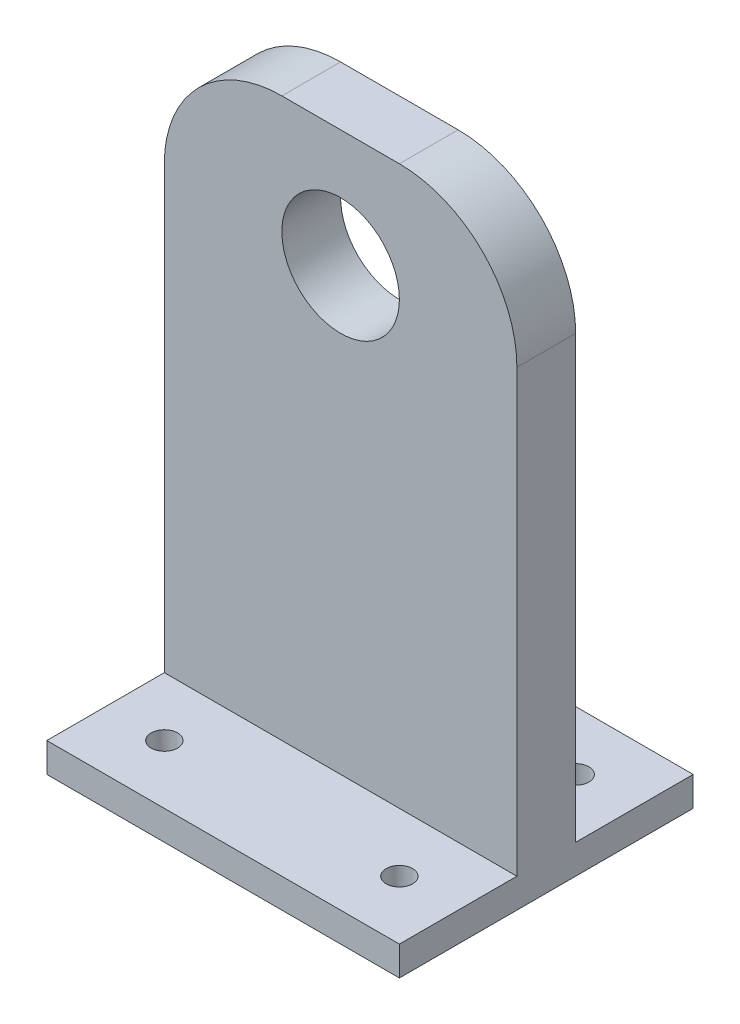
ISO-10303-21;
HEADER;
FILE_DESCRIPTION(('STEP AP214'),'2;1');
FILE_NAME('part.step','',(''),(''),'','','');
FILE_SCHEMA(('AUTOMOTIVE_DESIGN { 1 0 10303 214 1 1 1 1 }'));
ENDSEC;
DATA;
#1=APPLICATION_CONTEXT('core data for automotive mechanical design processes');
#2=APPLICATION_PROTOCOL_DEFINITION('international standard','automotive_design',2000,#1);
#3=PRODUCT_CONTEXT('',#1,'mechanical');
#4=PRODUCT('Part','Part','',(#3));
#5=PRODUCT_RELATED_PRODUCT_CATEGORY('part','',(#4));
#6=PRODUCT_DEFINITION_FORMATION('','',#4);
#7=PRODUCT_DEFINITION_CONTEXT('part definition',#1,'design');
#8=PRODUCT_DEFINITION('design','',#6,#7);
#9=PRODUCT_DEFINITION_SHAPE('','',#8);
#10=(LENGTH_UNIT() NAMED_UNIT(*) SI_UNIT(.MILLI.,.METRE.));
#11=(NAMED_UNIT(*) PLANE_ANGLE_UNIT() SI_UNIT($,.RADIAN.));
#12=(NAMED_UNIT(*) SI_UNIT($,.STERADIAN.) SOLID_ANGLE_UNIT());
#13=UNCERTAINTY_MEASURE_WITH_UNIT(LENGTH_MEASURE(1.E-05),#10,'distance_accuracy_value','');
#14=(GEOMETRIC_REPRESENTATION_CONTEXT(3) GLOBAL_UNCERTAINTY_ASSIGNED_CONTEXT((#13)) GLOBAL_UNIT_ASSIGNED_CONTEXT((#10,
#11,#12)) REPRESENTATION_CONTEXT('',''));
#15=CARTESIAN_POINT('',(0.,0.,0.));
#16=DIRECTION('',(0.,0.,1.));
#17=DIRECTION('',(1.,0.,0.));
#18=AXIS2_PLACEMENT_3D('',#15,#16,#17);
#19=CARTESIAN_POINT('',(0.,0.,10.));
#20=DIRECTION('',(0.,0.,1.));
#21=DIRECTION('',(1.,0.,0.));
#22=AXIS2_PLACEMENT_3D('',#19,#20,#21);
#23=PLANE('',#22);
#24=CARTESIAN_POINT('',(0.,80.,10.));
#25=DIRECTION('',(0.,0.,1.));
#26=DIRECTION('',(1.,0.,0.));
#27=AXIS2_PLACEMENT_3D('',#24,#25,#26);
#28=CIRCLE('',#27,10.);
#29=CARTESIAN_POINT('',(10.,80.,10.));
#30=VERTEX_POINT('',#29);
#31=EDGE_CURVE('E161',#30,#30,#28,.T.);
#32=ORIENTED_EDGE('',*,*,#31,.F.);
#33=EDGE_LOOP('',(#32));
#34=FACE_BOUND('',#33,.T.);
#35=DIRECTION('',(0.,-1.,0.));
#36=VECTOR('',#35,1.);
#37=CARTESIAN_POINT('',(-30.,100.,10.));
#38=LINE('',#37,#36);
#39=CARTESIAN_POINT('',(-30.,80.,10.));
#40=VERTEX_POINT('',#39);
#41=CARTESIAN_POINT('',(-30.,5.,10.));
#42=VERTEX_POINT('',#41);
#43=EDGE_CURVE('E52',#40,#42,#38,.T.);
#44=ORIENTED_EDGE('',*,*,#43,.T.);
#45=DIRECTION('',(1.,0.,0.));
#46=VECTOR('',#45,1.);
#47=CARTESIAN_POINT('',(0.,5.,10.));
#48=LINE('',#47,#46);
#49=CARTESIAN_POINT('',(30.,5.,10.));
#50=VERTEX_POINT('',#49);
#51=EDGE_CURVE('E56',#42,#50,#48,.T.);
#52=ORIENTED_EDGE('',*,*,#51,.T.);
#53=DIRECTION('',(0.,1.,0.));
#54=VECTOR('',#53,1.);
#55=CARTESIAN_POINT('',(30.,100.,10.));
#56=LINE('',#55,#54);
#57=CARTESIAN_POINT('',(30.,80.,10.));
#58=VERTEX_POINT('',#57);
#59=EDGE_CURVE('E165',#50,#58,#56,.T.);
#60=ORIENTED_EDGE('',*,*,#59,.T.);
#61=CARTESIAN_POINT('',(10.,80.,10.));
#62=DIRECTION('',(0.,0.,1.));
#63=DIRECTION('',(1.,0.,0.));
#64=AXIS2_PLACEMENT_3D('',#61,#62,#63);
#65=CIRCLE('',#64,20.);
#66=CARTESIAN_POINT('',(10.,100.,10.));
#67=VERTEX_POINT('',#66);
#68=EDGE_CURVE('E45',#58,#67,#65,.T.);
#69=ORIENTED_EDGE('',*,*,#68,.T.);
#70=DIRECTION('',(-1.,0.,0.));
#71=VECTOR('',#70,1.);
#72=CARTESIAN_POINT('',(-30.,100.,10.));
#73=LINE('',#72,#71);
#74=CARTESIAN_POINT('',(-9.99999999999999,100.,10.));
#75=VERTEX_POINT('',#74);
#76=EDGE_CURVE('E168',#67,#75,#73,.T.);
#77=ORIENTED_EDGE('',*,*,#76,.T.);
#78=CARTESIAN_POINT('',(-9.99999999999999,80.,10.));
#79=DIRECTION('',(0.,0.,1.));
#80=DIRECTION('',(1.,0.,0.));
#81=AXIS2_PLACEMENT_3D('',#78,#79,#80);
#82=CIRCLE('',#81,20.);
#83=EDGE_CURVE('E193',#75,#40,#82,.T.);
#84=ORIENTED_EDGE('',*,*,#83,.T.);
#85=EDGE_LOOP('',(#44,#52,#60,#69,#77,#84));
#86=FACE_BOUND('',#85,.T.);
#87=ADVANCED_FACE('F36',(#34,#86),#23,.T.);
#88=CARTESIAN_POINT('',(0.,0.,0.));
#89=DIRECTION('',(0.,0.,1.));
#90=DIRECTION('',(1.,0.,0.));
#91=AXIS2_PLACEMENT_3D('',#88,#89,#90);
#92=PLANE('',#91);
#93=CARTESIAN_POINT('',(0.,80.,0.));
#94=DIRECTION('',(0.,0.,1.));
#95=DIRECTION('',(1.,0.,0.));
#96=AXIS2_PLACEMENT_3D('',#93,#94,#95);
#97=CIRCLE('',#96,10.);
#98=CARTESIAN_POINT('',(10.,80.,0.));
#99=VERTEX_POINT('',#98);
#100=EDGE_CURVE('E40',#99,#99,#97,.T.);
#101=ORIENTED_EDGE('',*,*,#100,.T.);
#102=EDGE_LOOP('',(#101));
#103=FACE_BOUND('',#102,.T.);
#104=DIRECTION('',(1.,0.,0.));
#105=VECTOR('',#104,1.);
#106=CARTESIAN_POINT('',(0.,5.,0.));
#107=LINE('',#106,#105);
#108=CARTESIAN_POINT('',(-30.,5.,0.));
#109=VERTEX_POINT('',#108);
#110=CARTESIAN_POINT('',(30.,5.,0.));
#111=VERTEX_POINT('',#110);
#112=EDGE_CURVE('E154',#109,#111,#107,.T.);
#113=ORIENTED_EDGE('',*,*,#112,.F.);
#114=DIRECTION('',(0.,-1.,0.));
#115=VECTOR('',#114,1.);
#116=CARTESIAN_POINT('',(-30.,100.,0.));
#117=LINE('',#116,#115);
#118=CARTESIAN_POINT('',(-30.,80.,0.));
#119=VERTEX_POINT('',#118);
#120=EDGE_CURVE('E118',#119,#109,#117,.T.);
#121=ORIENTED_EDGE('',*,*,#120,.F.);
#122=CARTESIAN_POINT('',(-9.99999999999999,80.,0.));
#123=DIRECTION('',(0.,0.,1.));
#124=DIRECTION('',(1.,0.,0.));
#125=AXIS2_PLACEMENT_3D('',#122,#123,#124);
#126=CIRCLE('',#125,20.);
#127=CARTESIAN_POINT('',(-9.99999999999999,100.,0.));
#128=VERTEX_POINT('',#127);
#129=EDGE_CURVE('E185',#119,#128,#126,.F.);
#130=ORIENTED_EDGE('',*,*,#129,.T.);
#131=DIRECTION('',(-1.,0.,0.));
#132=VECTOR('',#131,1.);
#133=CARTESIAN_POINT('',(-30.,100.,0.));
#134=LINE('',#133,#132);
#135=CARTESIAN_POINT('',(10.,100.,0.));
#136=VERTEX_POINT('',#135);
#137=EDGE_CURVE('E166',#136,#128,#134,.T.);
#138=ORIENTED_EDGE('',*,*,#137,.F.);
#139=CARTESIAN_POINT('',(10.,80.,0.));
#140=DIRECTION('',(0.,0.,1.));
#141=DIRECTION('',(1.,0.,0.));
#142=AXIS2_PLACEMENT_3D('',#139,#140,#141);
#143=CIRCLE('',#142,20.);
#144=CARTESIAN_POINT('',(30.,80.,0.));
#145=VERTEX_POINT('',#144);
#146=EDGE_CURVE('E187',#136,#145,#143,.F.);
#147=ORIENTED_EDGE('',*,*,#146,.T.);
#148=DIRECTION('',(0.,1.,0.));
#149=VECTOR('',#148,1.);
#150=CARTESIAN_POINT('',(30.,100.,0.));
#151=LINE('',#150,#149);
#152=EDGE_CURVE('E173',#111,#145,#151,.T.);
#153=ORIENTED_EDGE('',*,*,#152,.F.);
#154=EDGE_LOOP('',(#113,#121,#130,#138,#147,#153));
#155=FACE_BOUND('',#154,.T.);
#156=ADVANCED_FACE('F208',(#103,#155),#92,.F.);
#157=CARTESIAN_POINT('',(0.,80.,10.));
#158=DIRECTION('',(0.,0.,-1.));
#159=DIRECTION('',(-1.,0.,0.));
#160=AXIS2_PLACEMENT_3D('',#157,#158,#159);
#161=CYLINDRICAL_SURFACE('',#160,10.);
#162=ORIENTED_EDGE('',*,*,#31,.T.);
#163=EDGE_LOOP('',(#162));
#164=FACE_BOUND('',#163,.T.);
#165=ORIENTED_EDGE('',*,*,#100,.F.);
#166=EDGE_LOOP('',(#165));
#167=FACE_BOUND('',#166,.T.);
#168=ADVANCED_FACE('F232',(#164,#167),#161,.F.);
#169=CARTESIAN_POINT('',(-30.,100.,10.));
#170=DIRECTION('',(1.,0.,0.));
#171=DIRECTION('',(0.,1.,0.));
#172=AXIS2_PLACEMENT_3D('',#169,#170,#171);
#173=PLANE('',#172);
#174=DIRECTION('',(0.,0.,-1.));
#175=VECTOR('',#174,1.);
#176=CARTESIAN_POINT('',(-30.,0.,10.));
#177=LINE('',#176,#175);
#178=CARTESIAN_POINT('',(-30.,0.,30.));
#179=VERTEX_POINT('',#178);
#180=CARTESIAN_POINT('',(-30.,0.,-20.));
#181=VERTEX_POINT('',#180);
#182=EDGE_CURVE('E178',#179,#181,#177,.T.);
#183=ORIENTED_EDGE('',*,*,#182,.F.);
#184=DIRECTION('',(0.,-1.,0.));
#185=VECTOR('',#184,1.);
#186=CARTESIAN_POINT('',(-30.,5.,30.));
#187=LINE('',#186,#185);
#188=CARTESIAN_POINT('',(-30.,5.,30.));
#189=VERTEX_POINT('',#188);
#190=EDGE_CURVE('E151',#189,#179,#187,.T.);
#191=ORIENTED_EDGE('',*,*,#190,.F.);
#192=DIRECTION('',(0.,0.,-1.));
#193=VECTOR('',#192,1.);
#194=CARTESIAN_POINT('',(-30.,5.,30.));
#195=LINE('',#194,#193);
#196=EDGE_CURVE('E122',#189,#42,#195,.T.);
#197=ORIENTED_EDGE('',*,*,#196,.T.);
#198=ORIENTED_EDGE('',*,*,#43,.F.);
#199=DIRECTION('',(0.,0.,-1.));
#200=VECTOR('',#199,1.);
#201=CARTESIAN_POINT('',(-30.,80.,10.));
#202=LINE('',#201,#200);
#203=EDGE_CURVE('E11',#40,#119,#202,.T.);
#204=ORIENTED_EDGE('',*,*,#203,.T.);
#205=ORIENTED_EDGE('',*,*,#120,.T.);
#206=CARTESIAN_POINT('',(-30.,5.,-20.));
#207=VERTEX_POINT('',#206);
#208=EDGE_CURVE('E112',#109,#207,#195,.T.);
#209=ORIENTED_EDGE('',*,*,#208,.T.);
#210=DIRECTION('',(0.,-1.,0.));
#211=VECTOR('',#210,1.);
#212=CARTESIAN_POINT('',(-30.,5.,-20.));
#213=LINE('',#212,#211);
#214=EDGE_CURVE('E115',#207,#181,#213,.T.);
#215=ORIENTED_EDGE('',*,*,#214,.T.);
#216=EDGE_LOOP('',(#183,#191,#197,#198,#204,#205,#209,#215));
#217=FACE_BOUND('',#216,.T.);
#218=ADVANCED_FACE('F114',(#217),#173,.F.);
#219=CARTESIAN_POINT('',(-30.,0.,10.));
#220=DIRECTION('',(0.,1.,0.));
#221=DIRECTION('',(0.,0.,1.));
#222=AXIS2_PLACEMENT_3D('',#219,#220,#221);
#223=PLANE('',#222);
#224=CARTESIAN_POINT('',(20.,0.,-10.));
#225=DIRECTION('',(0.,1.,0.));
#226=DIRECTION('',(0.,0.,1.));
#227=AXIS2_PLACEMENT_3D('',#224,#225,#226);
#228=CIRCLE('',#227,2.25);
#229=CARTESIAN_POINT('',(20.,0.,-7.75));
#230=VERTEX_POINT('',#229);
#231=EDGE_CURVE('E298',#230,#230,#228,.T.);
#232=ORIENTED_EDGE('',*,*,#231,.T.);
#233=EDGE_LOOP('',(#232));
#234=FACE_BOUND('',#233,.T.);
#235=CARTESIAN_POINT('',(-20.,0.,20.));
#236=DIRECTION('',(0.,1.,0.));
#237=DIRECTION('',(0.,0.,1.));
#238=AXIS2_PLACEMENT_3D('',#235,#236,#237);
#239=CIRCLE('',#238,2.25);
#240=CARTESIAN_POINT('',(-20.,0.,22.25));
#241=VERTEX_POINT('',#240);
#242=EDGE_CURVE('E304',#241,#241,#239,.T.);
#243=ORIENTED_EDGE('',*,*,#242,.T.);
#244=EDGE_LOOP('',(#243));
#245=FACE_BOUND('',#244,.T.);
#246=CARTESIAN_POINT('',(20.,0.,20.));
#247=DIRECTION('',(0.,1.,0.));
#248=DIRECTION('',(0.,0.,1.));
#249=AXIS2_PLACEMENT_3D('',#246,#247,#248);
#250=CIRCLE('',#249,2.25);
#251=CARTESIAN_POINT('',(20.,0.,22.25));
#252=VERTEX_POINT('',#251);
#253=EDGE_CURVE('E288',#252,#252,#250,.T.);
#254=ORIENTED_EDGE('',*,*,#253,.T.);
#255=EDGE_LOOP('',(#254));
#256=FACE_BOUND('',#255,.T.);
#257=CARTESIAN_POINT('',(-20.,0.,-10.));
#258=DIRECTION('',(0.,1.,0.));
#259=DIRECTION('',(0.,0.,1.));
#260=AXIS2_PLACEMENT_3D('',#257,#258,#259);
#261=CIRCLE('',#260,2.25);
#262=CARTESIAN_POINT('',(-20.,0.,-7.75));
#263=VERTEX_POINT('',#262);
#264=EDGE_CURVE('E148',#263,#263,#261,.T.);
#265=ORIENTED_EDGE('',*,*,#264,.T.);
#266=EDGE_LOOP('',(#265));
#267=FACE_BOUND('',#266,.T.);
#268=ORIENTED_EDGE('',*,*,#182,.T.);
#269=DIRECTION('',(1.,0.,0.));
#270=VECTOR('',#269,1.);
#271=CARTESIAN_POINT('',(-30.,0.,-20.));
#272=LINE('',#271,#270);
#273=CARTESIAN_POINT('',(30.,0.,-20.));
#274=VERTEX_POINT('',#273);
#275=EDGE_CURVE('E131',#181,#274,#272,.T.);
#276=ORIENTED_EDGE('',*,*,#275,.T.);
#277=DIRECTION('',(0.,0.,-1.));
#278=VECTOR('',#277,1.);
#279=CARTESIAN_POINT('',(30.,0.,10.));
#280=LINE('',#279,#278);
#281=CARTESIAN_POINT('',(30.,0.,30.));
#282=VERTEX_POINT('',#281);
#283=EDGE_CURVE('E171',#282,#274,#280,.T.);
#284=ORIENTED_EDGE('',*,*,#283,.F.);
#285=DIRECTION('',(-1.,0.,0.));
#286=VECTOR('',#285,1.);
#287=CARTESIAN_POINT('',(-30.,0.,30.));
#288=LINE('',#287,#286);
#289=EDGE_CURVE('E123',#282,#179,#288,.T.);
#290=ORIENTED_EDGE('',*,*,#289,.T.);
#291=EDGE_LOOP('',(#268,#276,#284,#290));
#292=FACE_BOUND('',#291,.T.);
#293=ADVANCED_FACE('F223',(#234,#245,#256,#267,#292),#223,.F.);
#294=CARTESIAN_POINT('',(30.,100.,10.));
#295=DIRECTION('',(-1.,0.,0.));
#296=DIRECTION('',(0.,-1.,0.));
#297=AXIS2_PLACEMENT_3D('',#294,#295,#296);
#298=PLANE('',#297);
#299=ORIENTED_EDGE('',*,*,#283,.T.);
#300=DIRECTION('',(0.,-1.,0.));
#301=VECTOR('',#300,1.);
#302=CARTESIAN_POINT('',(30.,5.,-20.));
#303=LINE('',#302,#301);
#304=CARTESIAN_POINT('',(30.,5.,-20.));
#305=VERTEX_POINT('',#304);
#306=EDGE_CURVE('E132',#305,#274,#303,.T.);
#307=ORIENTED_EDGE('',*,*,#306,.F.);
#308=DIRECTION('',(0.,0.,1.));
#309=VECTOR('',#308,1.);
#310=CARTESIAN_POINT('',(30.,5.,30.));
#311=LINE('',#310,#309);
#312=EDGE_CURVE('E138',#305,#111,#311,.T.);
#313=ORIENTED_EDGE('',*,*,#312,.T.);
#314=ORIENTED_EDGE('',*,*,#152,.T.);
#315=DIRECTION('',(0.,0.,-1.));
#316=VECTOR('',#315,1.);
#317=CARTESIAN_POINT('',(30.,80.,10.));
#318=LINE('',#317,#316);
#319=EDGE_CURVE('E190',#145,#58,#318,.F.);
#320=ORIENTED_EDGE('',*,*,#319,.T.);
#321=ORIENTED_EDGE('',*,*,#59,.F.);
#322=CARTESIAN_POINT('',(30.,5.,30.));
#323=VERTEX_POINT('',#322);
#324=EDGE_CURVE('E139',#50,#323,#311,.T.);
#325=ORIENTED_EDGE('',*,*,#324,.T.);
#326=DIRECTION('',(0.,-1.,0.));
#327=VECTOR('',#326,1.);
#328=CARTESIAN_POINT('',(30.,5.,30.));
#329=LINE('',#328,#327);
#330=EDGE_CURVE('E155',#323,#282,#329,.T.);
#331=ORIENTED_EDGE('',*,*,#330,.T.);
#332=EDGE_LOOP('',(#299,#307,#313,#314,#320,#321,#325,#331));
#333=FACE_BOUND('',#332,.T.);
#334=ADVANCED_FACE('F221',(#333),#298,.F.);
#335=CARTESIAN_POINT('',(-30.,100.,10.));
#336=DIRECTION('',(0.,-1.,0.));
#337=DIRECTION('',(0.,0.,-1.));
#338=AXIS2_PLACEMENT_3D('',#335,#336,#337);
#339=PLANE('',#338);
#340=ORIENTED_EDGE('',*,*,#76,.F.);
#341=DIRECTION('',(0.,0.,-1.));
#342=VECTOR('',#341,1.);
#343=CARTESIAN_POINT('',(10.,100.,10.));
#344=LINE('',#343,#342);
#345=EDGE_CURVE('E182',#67,#136,#344,.T.);
#346=ORIENTED_EDGE('',*,*,#345,.T.);
#347=ORIENTED_EDGE('',*,*,#137,.T.);
#348=DIRECTION('',(0.,0.,-1.));
#349=VECTOR('',#348,1.);
#350=CARTESIAN_POINT('',(-9.99999999999999,100.,10.));
#351=LINE('',#350,#349);
#352=EDGE_CURVE('E180',#128,#75,#351,.F.);
#353=ORIENTED_EDGE('',*,*,#352,.T.);
#354=EDGE_LOOP('',(#340,#346,#347,#353));
#355=FACE_BOUND('',#354,.T.);
#356=ADVANCED_FACE('F202',(#355),#339,.F.);
#357=CARTESIAN_POINT('',(10.,80.,10.));
#358=DIRECTION('',(0.,0.,-1.));
#359=DIRECTION('',(-1.,0.,0.));
#360=AXIS2_PLACEMENT_3D('',#357,#358,#359);
#361=CYLINDRICAL_SURFACE('',#360,20.);
#362=ORIENTED_EDGE('',*,*,#68,.F.);
#363=ORIENTED_EDGE('',*,*,#319,.F.);
#364=ORIENTED_EDGE('',*,*,#146,.F.);
#365=ORIENTED_EDGE('',*,*,#345,.F.);
#366=EDGE_LOOP('',(#362,#363,#364,#365));
#367=FACE_BOUND('',#366,.T.);
#368=ADVANCED_FACE('F205',(#367),#361,.T.);
#369=CARTESIAN_POINT('',(-9.99999999999999,80.,10.));
#370=DIRECTION('',(0.,0.,-1.));
#371=DIRECTION('',(-1.,0.,0.));
#372=AXIS2_PLACEMENT_3D('',#369,#370,#371);
#373=CYLINDRICAL_SURFACE('',#372,20.);
#374=ORIENTED_EDGE('',*,*,#83,.F.);
#375=ORIENTED_EDGE('',*,*,#352,.F.);
#376=ORIENTED_EDGE('',*,*,#129,.F.);
#377=ORIENTED_EDGE('',*,*,#203,.F.);
#378=EDGE_LOOP('',(#374,#375,#376,#377));
#379=FACE_BOUND('',#378,.T.);
#380=ADVANCED_FACE('F38',(#379),#373,.T.);
#381=CARTESIAN_POINT('',(-30.,5.,-20.));
#382=DIRECTION('',(0.,0.,-1.));
#383=DIRECTION('',(-1.,0.,0.));
#384=AXIS2_PLACEMENT_3D('',#381,#382,#383);
#385=PLANE('',#384);
#386=ORIENTED_EDGE('',*,*,#275,.F.);
#387=ORIENTED_EDGE('',*,*,#214,.F.);
#388=DIRECTION('',(1.,0.,0.));
#389=VECTOR('',#388,1.);
#390=CARTESIAN_POINT('',(-30.,5.,-20.));
#391=LINE('',#390,#389);
#392=EDGE_CURVE('E129',#207,#305,#391,.T.);
#393=ORIENTED_EDGE('',*,*,#392,.T.);
#394=ORIENTED_EDGE('',*,*,#306,.T.);
#395=EDGE_LOOP('',(#386,#387,#393,#394));
#396=FACE_BOUND('',#395,.T.);
#397=ADVANCED_FACE('F127',(#396),#385,.T.);
#398=CARTESIAN_POINT('',(0.,5.,0.));
#399=DIRECTION('',(0.,-1.,0.));
#400=DIRECTION('',(0.,0.,-1.));
#401=AXIS2_PLACEMENT_3D('',#398,#399,#400);
#402=PLANE('',#401);
#403=CARTESIAN_POINT('',(20.,5.,-10.));
#404=DIRECTION('',(0.,1.,0.));
#405=DIRECTION('',(0.,0.,1.));
#406=AXIS2_PLACEMENT_3D('',#403,#404,#405);
#407=CIRCLE('',#406,2.25);
#408=CARTESIAN_POINT('',(20.,5.,-7.75));
#409=VERTEX_POINT('',#408);
#410=EDGE_CURVE('E301',#409,#409,#407,.T.);
#411=ORIENTED_EDGE('',*,*,#410,.F.);
#412=EDGE_LOOP('',(#411));
#413=FACE_BOUND('',#412,.T.);
#414=CARTESIAN_POINT('',(-20.,5.,-10.));
#415=DIRECTION('',(0.,1.,0.));
#416=DIRECTION('',(0.,0.,1.));
#417=AXIS2_PLACEMENT_3D('',#414,#415,#416);
#418=CIRCLE('',#417,2.25);
#419=CARTESIAN_POINT('',(-20.,5.,-7.75));
#420=VERTEX_POINT('',#419);
#421=EDGE_CURVE('E300',#420,#420,#418,.T.);
#422=ORIENTED_EDGE('',*,*,#421,.F.);
#423=EDGE_LOOP('',(#422));
#424=FACE_BOUND('',#423,.T.);
#425=ORIENTED_EDGE('',*,*,#208,.F.);
#426=ORIENTED_EDGE('',*,*,#112,.T.);
#427=ORIENTED_EDGE('',*,*,#312,.F.);
#428=ORIENTED_EDGE('',*,*,#392,.F.);
#429=EDGE_LOOP('',(#425,#426,#427,#428));
#430=FACE_BOUND('',#429,.T.);
#431=ADVANCED_FACE('F136',(#413,#424,#430),#402,.F.);
#432=CARTESIAN_POINT('',(-30.,5.,30.));
#433=DIRECTION('',(0.,0.,1.));
#434=DIRECTION('',(1.,0.,0.));
#435=AXIS2_PLACEMENT_3D('',#432,#433,#434);
#436=PLANE('',#435);
#437=ORIENTED_EDGE('',*,*,#289,.F.);
#438=ORIENTED_EDGE('',*,*,#330,.F.);
#439=DIRECTION('',(-1.,0.,0.));
#440=VECTOR('',#439,1.);
#441=CARTESIAN_POINT('',(-30.,5.,30.));
#442=LINE('',#441,#440);
#443=EDGE_CURVE('E133',#323,#189,#442,.T.);
#444=ORIENTED_EDGE('',*,*,#443,.T.);
#445=ORIENTED_EDGE('',*,*,#190,.T.);
#446=EDGE_LOOP('',(#437,#438,#444,#445));
#447=FACE_BOUND('',#446,.T.);
#448=ADVANCED_FACE('F219',(#447),#436,.T.);
#449=CARTESIAN_POINT('',(-20.,5.,20.));
#450=DIRECTION('',(0.,1.,0.));
#451=DIRECTION('',(0.,0.,1.));
#452=AXIS2_PLACEMENT_3D('',#449,#450,#451);
#453=CIRCLE('',#452,2.25);
#454=CARTESIAN_POINT('',(-20.,5.,22.25));
#455=VERTEX_POINT('',#454);
#456=EDGE_CURVE('E294',#455,#455,#453,.T.);
#457=ORIENTED_EDGE('',*,*,#456,.F.);
#458=EDGE_LOOP('',(#457));
#459=FACE_BOUND('',#458,.T.);
#460=CARTESIAN_POINT('',(20.,5.,20.));
#461=DIRECTION('',(0.,1.,0.));
#462=DIRECTION('',(0.,0.,1.));
#463=AXIS2_PLACEMENT_3D('',#460,#461,#462);
#464=CIRCLE('',#463,2.25);
#465=CARTESIAN_POINT('',(20.,5.,22.25));
#466=VERTEX_POINT('',#465);
#467=EDGE_CURVE('E291',#466,#466,#464,.T.);
#468=ORIENTED_EDGE('',*,*,#467,.F.);
#469=EDGE_LOOP('',(#468));
#470=FACE_BOUND('',#469,.T.);
#471=ORIENTED_EDGE('',*,*,#51,.F.);
#472=ORIENTED_EDGE('',*,*,#196,.F.);
#473=ORIENTED_EDGE('',*,*,#443,.F.);
#474=ORIENTED_EDGE('',*,*,#324,.F.);
#475=EDGE_LOOP('',(#471,#472,#473,#474));
#476=FACE_BOUND('',#475,.T.);
#477=ADVANCED_FACE('F214',(#459,#470,#476),#402,.F.);
#478=CARTESIAN_POINT('',(20.,0.,20.));
#479=DIRECTION('',(0.,1.,0.));
#480=DIRECTION('',(0.,0.,1.));
#481=AXIS2_PLACEMENT_3D('',#478,#479,#480);
#482=CYLINDRICAL_SURFACE('',#481,2.25);
#483=ORIENTED_EDGE('',*,*,#253,.F.);
#484=EDGE_LOOP('',(#483));
#485=FACE_BOUND('',#484,.T.);
#486=ORIENTED_EDGE('',*,*,#467,.T.);
#487=EDGE_LOOP('',(#486));
#488=FACE_BOUND('',#487,.T.);
#489=ADVANCED_FACE('F267',(#485,#488),#482,.F.);
#490=CARTESIAN_POINT('',(-20.,0.,20.));
#491=DIRECTION('',(0.,1.,0.));
#492=DIRECTION('',(0.,0.,1.));
#493=AXIS2_PLACEMENT_3D('',#490,#491,#492);
#494=CYLINDRICAL_SURFACE('',#493,2.25);
#495=ORIENTED_EDGE('',*,*,#242,.F.);
#496=EDGE_LOOP('',(#495));
#497=FACE_BOUND('',#496,.T.);
#498=ORIENTED_EDGE('',*,*,#456,.T.);
#499=EDGE_LOOP('',(#498));
#500=FACE_BOUND('',#499,.T.);
#501=ADVANCED_FACE('F273',(#497,#500),#494,.F.);
#502=CARTESIAN_POINT('',(-20.,0.,-10.));
#503=DIRECTION('',(0.,1.,0.));
#504=DIRECTION('',(0.,0.,1.));
#505=AXIS2_PLACEMENT_3D('',#502,#503,#504);
#506=CYLINDRICAL_SURFACE('',#505,2.25);
#507=ORIENTED_EDGE('',*,*,#264,.F.);
#508=EDGE_LOOP('',(#507));
#509=FACE_BOUND('',#508,.T.);
#510=ORIENTED_EDGE('',*,*,#421,.T.);
#511=EDGE_LOOP('',(#510));
#512=FACE_BOUND('',#511,.T.);
#513=ADVANCED_FACE('F269',(#509,#512),#506,.F.);
#514=CARTESIAN_POINT('',(20.,0.,-10.));
#515=DIRECTION('',(0.,1.,0.));
#516=DIRECTION('',(0.,0.,1.));
#517=AXIS2_PLACEMENT_3D('',#514,#515,#516);
#518=CYLINDRICAL_SURFACE('',#517,2.25);
#519=ORIENTED_EDGE('',*,*,#231,.F.);
#520=EDGE_LOOP('',(#519));
#521=FACE_BOUND('',#520,.T.);
#522=ORIENTED_EDGE('',*,*,#410,.T.);
#523=EDGE_LOOP('',(#522));
#524=FACE_BOUND('',#523,.T.);
#525=ADVANCED_FACE('F272',(#521,#524),#518,.F.);
#526=CLOSED_SHELL('',(#87,#156,#168,#218,#293,#334,#356,#368,#380,#397,#431,#448,#477,#489,#501,
#513,#525));
#527=MANIFOLD_SOLID_BREP('B2',#526);
#528=ADVANCED_BREP_SHAPE_REPRESENTATION('',(#18,#527),#14);
#529=SHAPE_DEFINITION_REPRESENTATION(#9,#528);
ENDSEC;
END-ISO-10303-21;
